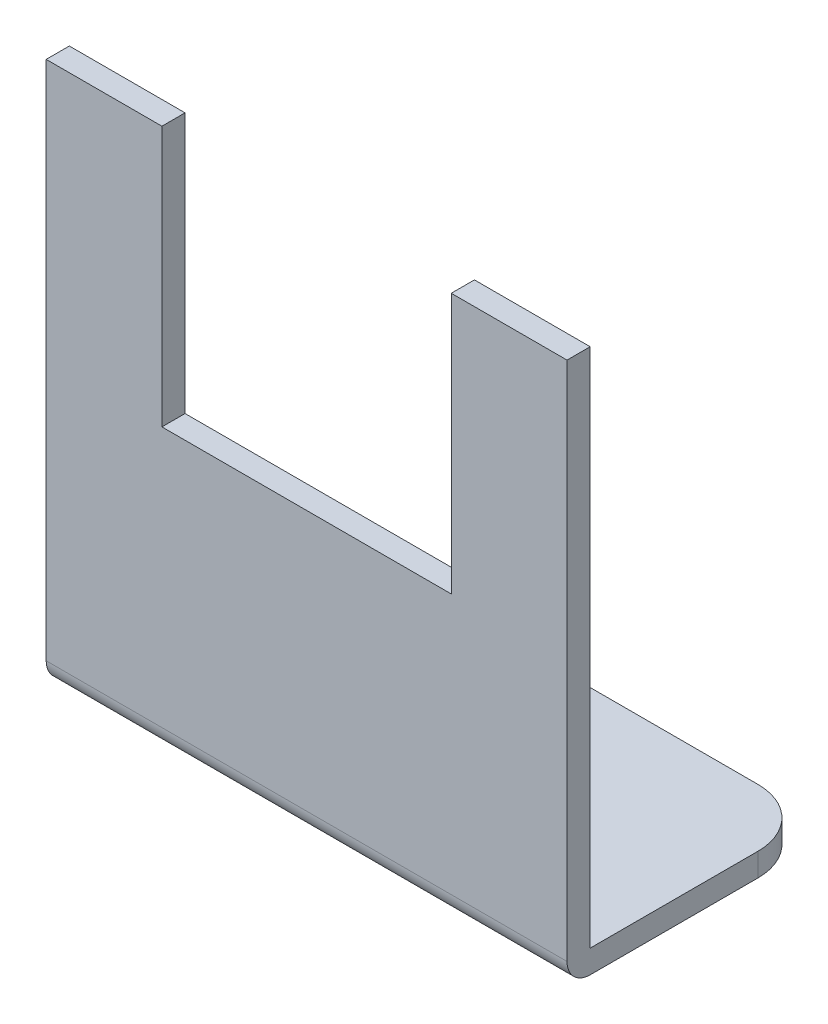
ISO-10303-21;
HEADER;
FILE_DESCRIPTION(('STEP AP214'),'2;1');
FILE_NAME('part.step','',(''),(''),'','','');
FILE_SCHEMA(('AUTOMOTIVE_DESIGN { 1 0 10303 214 1 1 1 1 }'));
ENDSEC;
DATA;
#1=APPLICATION_CONTEXT('core data for automotive mechanical design processes');
#2=APPLICATION_PROTOCOL_DEFINITION('international standard','automotive_design',2000,#1);
#3=PRODUCT_CONTEXT('',#1,'mechanical');
#4=PRODUCT('Part','Part','',(#3));
#5=PRODUCT_RELATED_PRODUCT_CATEGORY('part','',(#4));
#6=PRODUCT_DEFINITION_FORMATION('','',#4);
#7=PRODUCT_DEFINITION_CONTEXT('part definition',#1,'design');
#8=PRODUCT_DEFINITION('design','',#6,#7);
#9=PRODUCT_DEFINITION_SHAPE('','',#8);
#10=(LENGTH_UNIT() NAMED_UNIT(*) SI_UNIT(.MILLI.,.METRE.));
#11=(NAMED_UNIT(*) PLANE_ANGLE_UNIT() SI_UNIT($,.RADIAN.));
#12=(NAMED_UNIT(*) SI_UNIT($,.STERADIAN.) SOLID_ANGLE_UNIT());
#13=UNCERTAINTY_MEASURE_WITH_UNIT(LENGTH_MEASURE(1.E-05),#10,'distance_accuracy_value','');
#14=(GEOMETRIC_REPRESENTATION_CONTEXT(3) GLOBAL_UNCERTAINTY_ASSIGNED_CONTEXT((#13)) GLOBAL_UNIT_ASSIGNED_CONTEXT((#10,
#11,#12)) REPRESENTATION_CONTEXT('',''));
#15=CARTESIAN_POINT('',(0.,0.,0.));
#16=DIRECTION('',(0.,0.,1.));
#17=DIRECTION('',(1.,0.,0.));
#18=AXIS2_PLACEMENT_3D('',#15,#16,#17);
#19=CARTESIAN_POINT('',(0.,0.,0.));
#20=DIRECTION('',(0.,0.,1.));
#21=DIRECTION('',(1.,0.,0.));
#22=AXIS2_PLACEMENT_3D('',#19,#20,#21);
#23=PLANE('',#22);
#24=DIRECTION('',(0.,-1.,0.));
#25=VECTOR('',#24,1.);
#26=CARTESIAN_POINT('',(12.5,0.,0.));
#27=LINE('',#26,#25);
#28=CARTESIAN_POINT('',(12.5,23.5,0.));
#29=VERTEX_POINT('',#28);
#30=CARTESIAN_POINT('',(12.5,0.999999999999997,0.));
#31=VERTEX_POINT('',#30);
#32=EDGE_CURVE('E245',#29,#31,#27,.T.);
#33=ORIENTED_EDGE('',*,*,#32,.F.);
#34=DIRECTION('',(1.,0.,0.));
#35=VECTOR('',#34,1.);
#36=CARTESIAN_POINT('',(-22.5,23.5,0.));
#37=LINE('',#36,#35);
#38=CARTESIAN_POINT('',(22.5,23.5,0.));
#39=VERTEX_POINT('',#38);
#40=EDGE_CURVE('E147',#29,#39,#37,.T.);
#41=ORIENTED_EDGE('',*,*,#40,.T.);
#42=DIRECTION('',(0.,-1.,0.));
#43=VECTOR('',#42,1.);
#44=CARTESIAN_POINT('',(22.5,23.5,0.));
#45=LINE('',#44,#43);
#46=CARTESIAN_POINT('',(22.5,-21.5,0.));
#47=VERTEX_POINT('',#46);
#48=EDGE_CURVE('E166',#39,#47,#45,.T.);
#49=ORIENTED_EDGE('',*,*,#48,.T.);
#50=DIRECTION('',(1.,0.,0.));
#51=VECTOR('',#50,1.);
#52=CARTESIAN_POINT('',(22.5,-21.5,0.));
#53=LINE('',#52,#51);
#54=CARTESIAN_POINT('',(-22.5,-21.5,0.));
#55=VERTEX_POINT('',#54);
#56=EDGE_CURVE('E215',#55,#47,#53,.T.);
#57=ORIENTED_EDGE('',*,*,#56,.F.);
#58=DIRECTION('',(0.,-1.,0.));
#59=VECTOR('',#58,1.);
#60=CARTESIAN_POINT('',(-22.5,23.5,0.));
#61=LINE('',#60,#59);
#62=CARTESIAN_POINT('',(-22.5,23.5,0.));
#63=VERTEX_POINT('',#62);
#64=EDGE_CURVE('E163',#63,#55,#61,.T.);
#65=ORIENTED_EDGE('',*,*,#64,.F.);
#66=CARTESIAN_POINT('',(-12.5,23.5,0.));
#67=VERTEX_POINT('',#66);
#68=EDGE_CURVE('E170',#63,#67,#37,.T.);
#69=ORIENTED_EDGE('',*,*,#68,.T.);
#70=DIRECTION('',(0.,-1.,0.));
#71=VECTOR('',#70,1.);
#72=CARTESIAN_POINT('',(-12.5,0.,0.));
#73=LINE('',#72,#71);
#74=CARTESIAN_POINT('',(-12.5,1.,0.));
#75=VERTEX_POINT('',#74);
#76=EDGE_CURVE('E148',#67,#75,#73,.T.);
#77=ORIENTED_EDGE('',*,*,#76,.T.);
#78=DIRECTION('',(1.,0.,0.));
#79=VECTOR('',#78,1.);
#80=CARTESIAN_POINT('',(0.,0.999999999999999,0.));
#81=LINE('',#80,#79);
#82=EDGE_CURVE('E246',#75,#31,#81,.T.);
#83=ORIENTED_EDGE('',*,*,#82,.T.);
#84=EDGE_LOOP('',(#33,#41,#49,#57,#65,#69,#77,#83));
#85=FACE_BOUND('',#84,.T.);
#86=ADVANCED_FACE('F32',(#85),#23,.F.);
#87=CARTESIAN_POINT('',(-22.5,23.5,2.));
#88=DIRECTION('',(0.,1.,0.));
#89=DIRECTION('',(0.,0.,1.));
#90=AXIS2_PLACEMENT_3D('',#87,#88,#89);
#91=PLANE('',#90);
#92=ORIENTED_EDGE('',*,*,#40,.F.);
#93=DIRECTION('',(0.,0.,1.));
#94=VECTOR('',#93,1.);
#95=CARTESIAN_POINT('',(12.5,23.5,-19.5));
#96=LINE('',#95,#94);
#97=CARTESIAN_POINT('',(12.5,23.5,2.));
#98=VERTEX_POINT('',#97);
#99=EDGE_CURVE('E130',#29,#98,#96,.T.);
#100=ORIENTED_EDGE('',*,*,#99,.T.);
#101=DIRECTION('',(1.,0.,0.));
#102=VECTOR('',#101,1.);
#103=CARTESIAN_POINT('',(-22.5,23.5,2.));
#104=LINE('',#103,#102);
#105=CARTESIAN_POINT('',(22.5,23.5,2.));
#106=VERTEX_POINT('',#105);
#107=EDGE_CURVE('E145',#98,#106,#104,.T.);
#108=ORIENTED_EDGE('',*,*,#107,.T.);
#109=DIRECTION('',(0.,0.,-1.));
#110=VECTOR('',#109,1.);
#111=CARTESIAN_POINT('',(22.5,23.5,2.));
#112=LINE('',#111,#110);
#113=EDGE_CURVE('E174',#106,#39,#112,.T.);
#114=ORIENTED_EDGE('',*,*,#113,.T.);
#115=EDGE_LOOP('',(#92,#100,#108,#114));
#116=FACE_BOUND('',#115,.T.);
#117=ADVANCED_FACE('F143',(#116),#91,.T.);
#118=CARTESIAN_POINT('',(0.,0.,2.));
#119=DIRECTION('',(0.,0.,1.));
#120=DIRECTION('',(1.,0.,0.));
#121=AXIS2_PLACEMENT_3D('',#118,#119,#120);
#122=PLANE('',#121);
#123=ORIENTED_EDGE('',*,*,#107,.F.);
#124=DIRECTION('',(0.,-1.,0.));
#125=VECTOR('',#124,1.);
#126=CARTESIAN_POINT('',(12.5,23.5,2.));
#127=LINE('',#126,#125);
#128=CARTESIAN_POINT('',(12.5,0.999999999999997,2.));
#129=VERTEX_POINT('',#128);
#130=EDGE_CURVE('E127',#98,#129,#127,.T.);
#131=ORIENTED_EDGE('',*,*,#130,.T.);
#132=DIRECTION('',(1.,0.,0.));
#133=VECTOR('',#132,1.);
#134=CARTESIAN_POINT('',(-12.5,1.,2.));
#135=LINE('',#134,#133);
#136=CARTESIAN_POINT('',(-12.5,1.,2.));
#137=VERTEX_POINT('',#136);
#138=EDGE_CURVE('E138',#137,#129,#135,.T.);
#139=ORIENTED_EDGE('',*,*,#138,.F.);
#140=DIRECTION('',(0.,-1.,0.));
#141=VECTOR('',#140,1.);
#142=CARTESIAN_POINT('',(-12.5,23.5,2.));
#143=LINE('',#142,#141);
#144=CARTESIAN_POINT('',(-12.5,23.5,2.));
#145=VERTEX_POINT('',#144);
#146=EDGE_CURVE('E258',#145,#137,#143,.T.);
#147=ORIENTED_EDGE('',*,*,#146,.F.);
#148=CARTESIAN_POINT('',(-22.5,23.5,2.));
#149=VERTEX_POINT('',#148);
#150=EDGE_CURVE('E155',#149,#145,#104,.T.);
#151=ORIENTED_EDGE('',*,*,#150,.F.);
#152=DIRECTION('',(0.,-1.,0.));
#153=VECTOR('',#152,1.);
#154=CARTESIAN_POINT('',(-22.5,23.5,2.));
#155=LINE('',#154,#153);
#156=CARTESIAN_POINT('',(-22.5,-21.5,2.));
#157=VERTEX_POINT('',#156);
#158=EDGE_CURVE('E159',#149,#157,#155,.T.);
#159=ORIENTED_EDGE('',*,*,#158,.T.);
#160=DIRECTION('',(1.,0.,0.));
#161=VECTOR('',#160,1.);
#162=CARTESIAN_POINT('',(22.5,-21.5,2.));
#163=LINE('',#162,#161);
#164=CARTESIAN_POINT('',(22.5,-21.5,2.));
#165=VERTEX_POINT('',#164);
#166=EDGE_CURVE('E181',#157,#165,#163,.T.);
#167=ORIENTED_EDGE('',*,*,#166,.T.);
#168=DIRECTION('',(0.,-1.,0.));
#169=VECTOR('',#168,1.);
#170=CARTESIAN_POINT('',(22.5,23.5,2.));
#171=LINE('',#170,#169);
#172=EDGE_CURVE('E154',#106,#165,#171,.T.);
#173=ORIENTED_EDGE('',*,*,#172,.F.);
#174=EDGE_LOOP('',(#123,#131,#139,#147,#151,#159,#167,#173));
#175=FACE_BOUND('',#174,.T.);
#176=ADVANCED_FACE('F151',(#175),#122,.T.);
#177=CARTESIAN_POINT('',(-22.5,23.5,2.));
#178=DIRECTION('',(1.,0.,0.));
#179=DIRECTION('',(0.,1.,0.));
#180=AXIS2_PLACEMENT_3D('',#177,#178,#179);
#181=PLANE('',#180);
#182=DIRECTION('',(0.,0.,1.));
#183=VECTOR('',#182,1.);
#184=CARTESIAN_POINT('',(-22.5,-21.5,-19.5));
#185=LINE('',#184,#183);
#186=CARTESIAN_POINT('',(-22.5,-21.5,-14.5));
#187=VERTEX_POINT('',#186);
#188=EDGE_CURVE('E167',#187,#55,#185,.T.);
#189=ORIENTED_EDGE('',*,*,#188,.F.);
#190=DIRECTION('',(0.,1.,0.));
#191=VECTOR('',#190,1.);
#192=CARTESIAN_POINT('',(-22.5,23.5,-14.5));
#193=LINE('',#192,#191);
#194=CARTESIAN_POINT('',(-22.5,-23.5,-14.5));
#195=VERTEX_POINT('',#194);
#196=EDGE_CURVE('E199',#187,#195,#193,.F.);
#197=ORIENTED_EDGE('',*,*,#196,.T.);
#198=DIRECTION('',(0.,0.,-1.));
#199=VECTOR('',#198,1.);
#200=CARTESIAN_POINT('',(-22.5,-23.5,2.));
#201=LINE('',#200,#199);
#202=CARTESIAN_POINT('',(-22.5,-23.5,0.));
#203=VERTEX_POINT('',#202);
#204=EDGE_CURVE('E178',#203,#195,#201,.T.);
#205=ORIENTED_EDGE('',*,*,#204,.F.);
#206=CARTESIAN_POINT('',(-22.5,-21.5,0.));
#207=DIRECTION('',(1.,0.,0.));
#208=DIRECTION('',(0.,1.,0.));
#209=AXIS2_PLACEMENT_3D('',#206,#207,#208);
#210=CIRCLE('',#209,2.);
#211=EDGE_CURVE('E187',#203,#157,#210,.F.);
#212=ORIENTED_EDGE('',*,*,#211,.T.);
#213=ORIENTED_EDGE('',*,*,#158,.F.);
#214=DIRECTION('',(0.,0.,-1.));
#215=VECTOR('',#214,1.);
#216=CARTESIAN_POINT('',(-22.5,23.5,2.));
#217=LINE('',#216,#215);
#218=EDGE_CURVE('E158',#149,#63,#217,.T.);
#219=ORIENTED_EDGE('',*,*,#218,.T.);
#220=ORIENTED_EDGE('',*,*,#64,.T.);
#221=EDGE_LOOP('',(#189,#197,#205,#212,#213,#219,#220));
#222=FACE_BOUND('',#221,.T.);
#223=ADVANCED_FACE('F224',(#222),#181,.F.);
#224=CARTESIAN_POINT('',(-22.5,-23.5,2.));
#225=DIRECTION('',(0.,1.,0.));
#226=DIRECTION('',(0.,0.,1.));
#227=AXIS2_PLACEMENT_3D('',#224,#225,#226);
#228=PLANE('',#227);
#229=CARTESIAN_POINT('',(0.,-23.5,-14.5));
#230=DIRECTION('',(0.,1.,0.));
#231=DIRECTION('',(-1.,0.,0.));
#232=AXIS2_PLACEMENT_3D('',#229,#230,#231);
#233=CIRCLE('',#232,1.5);
#234=CARTESIAN_POINT('',(-1.5,-23.5,-14.5));
#235=VERTEX_POINT('',#234);
#236=EDGE_CURVE('E139',#235,#235,#233,.T.);
#237=ORIENTED_EDGE('',*,*,#236,.T.);
#238=EDGE_LOOP('',(#237));
#239=FACE_BOUND('',#238,.T.);
#240=ORIENTED_EDGE('',*,*,#204,.T.);
#241=CARTESIAN_POINT('',(-17.5,-23.5,-14.5));
#242=DIRECTION('',(0.,1.,0.));
#243=DIRECTION('',(0.,0.,1.));
#244=AXIS2_PLACEMENT_3D('',#241,#242,#243);
#245=CIRCLE('',#244,5.);
#246=CARTESIAN_POINT('',(-17.5,-23.5,-19.5));
#247=VERTEX_POINT('',#246);
#248=EDGE_CURVE('E40',#195,#247,#245,.F.);
#249=ORIENTED_EDGE('',*,*,#248,.T.);
#250=DIRECTION('',(-1.,0.,0.));
#251=VECTOR('',#250,1.);
#252=CARTESIAN_POINT('',(22.5,-23.5,-19.5));
#253=LINE('',#252,#251);
#254=CARTESIAN_POINT('',(17.5,-23.5,-19.5));
#255=VERTEX_POINT('',#254);
#256=EDGE_CURVE('E204',#255,#247,#253,.T.);
#257=ORIENTED_EDGE('',*,*,#256,.F.);
#258=CARTESIAN_POINT('',(17.5,-23.5,-14.5));
#259=DIRECTION('',(0.,1.,0.));
#260=DIRECTION('',(0.,0.,1.));
#261=AXIS2_PLACEMENT_3D('',#258,#259,#260);
#262=CIRCLE('',#261,5.);
#263=CARTESIAN_POINT('',(22.5,-23.5,-14.5));
#264=VERTEX_POINT('',#263);
#265=EDGE_CURVE('E55',#255,#264,#262,.F.);
#266=ORIENTED_EDGE('',*,*,#265,.T.);
#267=DIRECTION('',(0.,0.,-1.));
#268=VECTOR('',#267,1.);
#269=CARTESIAN_POINT('',(22.5,-23.5,2.));
#270=LINE('',#269,#268);
#271=CARTESIAN_POINT('',(22.5,-23.5,0.));
#272=VERTEX_POINT('',#271);
#273=EDGE_CURVE('E176',#272,#264,#270,.T.);
#274=ORIENTED_EDGE('',*,*,#273,.F.);
#275=DIRECTION('',(1.,0.,0.));
#276=VECTOR('',#275,1.);
#277=CARTESIAN_POINT('',(-22.5,-23.5,0.));
#278=LINE('',#277,#276);
#279=EDGE_CURVE('E185',#272,#203,#278,.F.);
#280=ORIENTED_EDGE('',*,*,#279,.T.);
#281=EDGE_LOOP('',(#240,#249,#257,#266,#274,#280));
#282=FACE_BOUND('',#281,.T.);
#283=ADVANCED_FACE('F203',(#239,#282),#228,.F.);
#284=CARTESIAN_POINT('',(22.5,23.5,2.));
#285=DIRECTION('',(1.,0.,0.));
#286=DIRECTION('',(0.,1.,0.));
#287=AXIS2_PLACEMENT_3D('',#284,#285,#286);
#288=PLANE('',#287);
#289=ORIENTED_EDGE('',*,*,#273,.T.);
#290=DIRECTION('',(0.,-1.,0.));
#291=VECTOR('',#290,1.);
#292=CARTESIAN_POINT('',(22.5,-21.5,-14.5));
#293=LINE('',#292,#291);
#294=CARTESIAN_POINT('',(22.5,-21.5,-14.5));
#295=VERTEX_POINT('',#294);
#296=EDGE_CURVE('E11',#264,#295,#293,.F.);
#297=ORIENTED_EDGE('',*,*,#296,.T.);
#298=DIRECTION('',(0.,0.,1.));
#299=VECTOR('',#298,1.);
#300=CARTESIAN_POINT('',(22.5,-21.5,-19.5));
#301=LINE('',#300,#299);
#302=EDGE_CURVE('E226',#295,#47,#301,.T.);
#303=ORIENTED_EDGE('',*,*,#302,.T.);
#304=ORIENTED_EDGE('',*,*,#48,.F.);
#305=ORIENTED_EDGE('',*,*,#113,.F.);
#306=ORIENTED_EDGE('',*,*,#172,.T.);
#307=CARTESIAN_POINT('',(22.5,-21.5,0.));
#308=DIRECTION('',(1.,0.,0.));
#309=DIRECTION('',(0.,1.,0.));
#310=AXIS2_PLACEMENT_3D('',#307,#308,#309);
#311=CIRCLE('',#310,2.);
#312=EDGE_CURVE('E183',#165,#272,#311,.T.);
#313=ORIENTED_EDGE('',*,*,#312,.T.);
#314=EDGE_LOOP('',(#289,#297,#303,#304,#305,#306,#313));
#315=FACE_BOUND('',#314,.T.);
#316=ADVANCED_FACE('F239',(#315),#288,.T.);
#317=DIRECTION('',(0.,0.,1.));
#318=VECTOR('',#317,1.);
#319=CARTESIAN_POINT('',(-12.5,23.5,-19.5));
#320=LINE('',#319,#318);
#321=EDGE_CURVE('E47',#67,#145,#320,.T.);
#322=ORIENTED_EDGE('',*,*,#321,.F.);
#323=ORIENTED_EDGE('',*,*,#68,.F.);
#324=ORIENTED_EDGE('',*,*,#218,.F.);
#325=ORIENTED_EDGE('',*,*,#150,.T.);
#326=EDGE_LOOP('',(#322,#323,#324,#325));
#327=FACE_BOUND('',#326,.T.);
#328=ADVANCED_FACE('F276',(#327),#91,.T.);
#329=CARTESIAN_POINT('',(22.5,-21.5,-19.5));
#330=DIRECTION('',(0.,-1.,0.));
#331=DIRECTION('',(1.,0.,0.));
#332=AXIS2_PLACEMENT_3D('',#329,#330,#331);
#333=PLANE('',#332);
#334=CARTESIAN_POINT('',(0.,-21.5,-14.5));
#335=DIRECTION('',(0.,1.,0.));
#336=DIRECTION('',(-1.,0.,0.));
#337=AXIS2_PLACEMENT_3D('',#334,#335,#336);
#338=CIRCLE('',#337,1.5);
#339=CARTESIAN_POINT('',(-1.5,-21.5,-14.5));
#340=VERTEX_POINT('',#339);
#341=EDGE_CURVE('E261',#340,#340,#338,.T.);
#342=ORIENTED_EDGE('',*,*,#341,.F.);
#343=EDGE_LOOP('',(#342));
#344=FACE_BOUND('',#343,.T.);
#345=DIRECTION('',(1.,0.,0.));
#346=VECTOR('',#345,1.);
#347=CARTESIAN_POINT('',(22.5,-21.5,-19.5));
#348=LINE('',#347,#346);
#349=CARTESIAN_POINT('',(-17.5,-21.5,-19.5));
#350=VERTEX_POINT('',#349);
#351=CARTESIAN_POINT('',(17.5,-21.5,-19.5));
#352=VERTEX_POINT('',#351);
#353=EDGE_CURVE('E214',#350,#352,#348,.T.);
#354=ORIENTED_EDGE('',*,*,#353,.F.);
#355=CARTESIAN_POINT('',(-17.5,-21.5,-14.5));
#356=DIRECTION('',(0.,-1.,0.));
#357=DIRECTION('',(1.,0.,0.));
#358=AXIS2_PLACEMENT_3D('',#355,#356,#357);
#359=CIRCLE('',#358,5.);
#360=EDGE_CURVE('E197',#350,#187,#359,.F.);
#361=ORIENTED_EDGE('',*,*,#360,.T.);
#362=ORIENTED_EDGE('',*,*,#188,.T.);
#363=ORIENTED_EDGE('',*,*,#56,.T.);
#364=ORIENTED_EDGE('',*,*,#302,.F.);
#365=CARTESIAN_POINT('',(17.5,-21.5,-14.5));
#366=DIRECTION('',(0.,-1.,0.));
#367=DIRECTION('',(1.,0.,0.));
#368=AXIS2_PLACEMENT_3D('',#365,#366,#367);
#369=CIRCLE('',#368,5.);
#370=EDGE_CURVE('E195',#295,#352,#369,.F.);
#371=ORIENTED_EDGE('',*,*,#370,.T.);
#372=EDGE_LOOP('',(#354,#361,#362,#363,#364,#371));
#373=FACE_BOUND('',#372,.T.);
#374=ADVANCED_FACE('F220',(#344,#373),#333,.F.);
#375=CARTESIAN_POINT('',(0.,0.,-19.5));
#376=DIRECTION('',(0.,0.,1.));
#377=DIRECTION('',(1.,0.,0.));
#378=AXIS2_PLACEMENT_3D('',#375,#376,#377);
#379=PLANE('',#378);
#380=ORIENTED_EDGE('',*,*,#256,.T.);
#381=DIRECTION('',(0.,1.,0.));
#382=VECTOR('',#381,1.);
#383=CARTESIAN_POINT('',(-17.5,0.,-19.5));
#384=LINE('',#383,#382);
#385=EDGE_CURVE('E192',#247,#350,#384,.T.);
#386=ORIENTED_EDGE('',*,*,#385,.T.);
#387=ORIENTED_EDGE('',*,*,#353,.T.);
#388=DIRECTION('',(0.,-1.,0.));
#389=VECTOR('',#388,1.);
#390=CARTESIAN_POINT('',(17.5,-23.5,-19.5));
#391=LINE('',#390,#389);
#392=EDGE_CURVE('E189',#352,#255,#391,.T.);
#393=ORIENTED_EDGE('',*,*,#392,.T.);
#394=EDGE_LOOP('',(#380,#386,#387,#393));
#395=FACE_BOUND('',#394,.T.);
#396=ADVANCED_FACE('F210',(#395),#379,.F.);
#397=CARTESIAN_POINT('',(0.,-21.5,0.));
#398=DIRECTION('',(-1.,0.,0.));
#399=DIRECTION('',(0.,0.,1.));
#400=AXIS2_PLACEMENT_3D('',#397,#398,#399);
#401=CYLINDRICAL_SURFACE('',#400,2.);
#402=ORIENTED_EDGE('',*,*,#211,.F.);
#403=ORIENTED_EDGE('',*,*,#279,.F.);
#404=ORIENTED_EDGE('',*,*,#312,.F.);
#405=ORIENTED_EDGE('',*,*,#166,.F.);
#406=EDGE_LOOP('',(#402,#403,#404,#405));
#407=FACE_BOUND('',#406,.T.);
#408=ADVANCED_FACE('F236',(#407),#401,.T.);
#409=CARTESIAN_POINT('',(-17.5,0.,-14.5));
#410=DIRECTION('',(0.,1.,0.));
#411=DIRECTION('',(-1.,0.,0.));
#412=AXIS2_PLACEMENT_3D('',#409,#410,#411);
#413=CYLINDRICAL_SURFACE('',#412,5.);
#414=ORIENTED_EDGE('',*,*,#248,.F.);
#415=ORIENTED_EDGE('',*,*,#196,.F.);
#416=ORIENTED_EDGE('',*,*,#360,.F.);
#417=ORIENTED_EDGE('',*,*,#385,.F.);
#418=EDGE_LOOP('',(#414,#415,#416,#417));
#419=FACE_BOUND('',#418,.T.);
#420=ADVANCED_FACE('F217',(#419),#413,.T.);
#421=CARTESIAN_POINT('',(17.5,0.,-14.5));
#422=DIRECTION('',(0.,1.,0.));
#423=DIRECTION('',(-1.,0.,0.));
#424=AXIS2_PLACEMENT_3D('',#421,#422,#423);
#425=CYLINDRICAL_SURFACE('',#424,5.);
#426=ORIENTED_EDGE('',*,*,#370,.F.);
#427=ORIENTED_EDGE('',*,*,#296,.F.);
#428=ORIENTED_EDGE('',*,*,#265,.F.);
#429=ORIENTED_EDGE('',*,*,#392,.F.);
#430=EDGE_LOOP('',(#426,#427,#428,#429));
#431=FACE_BOUND('',#430,.T.);
#432=ADVANCED_FACE('F34',(#431),#425,.T.);
#433=CARTESIAN_POINT('',(12.5,23.5,-19.5));
#434=DIRECTION('',(-1.,0.,0.));
#435=DIRECTION('',(0.,-1.,0.));
#436=AXIS2_PLACEMENT_3D('',#433,#434,#435);
#437=PLANE('',#436);
#438=ORIENTED_EDGE('',*,*,#32,.T.);
#439=DIRECTION('',(0.,0.,1.));
#440=VECTOR('',#439,1.);
#441=CARTESIAN_POINT('',(12.5,0.999999999999997,-19.5));
#442=LINE('',#441,#440);
#443=EDGE_CURVE('E133',#31,#129,#442,.T.);
#444=ORIENTED_EDGE('',*,*,#443,.T.);
#445=ORIENTED_EDGE('',*,*,#130,.F.);
#446=ORIENTED_EDGE('',*,*,#99,.F.);
#447=EDGE_LOOP('',(#438,#444,#445,#446));
#448=FACE_BOUND('',#447,.T.);
#449=ADVANCED_FACE('F129',(#448),#437,.T.);
#450=CARTESIAN_POINT('',(-12.5,1.,-19.5));
#451=DIRECTION('',(0.,-1.,0.));
#452=DIRECTION('',(1.,0.,0.));
#453=AXIS2_PLACEMENT_3D('',#450,#451,#452);
#454=PLANE('',#453);
#455=DIRECTION('',(0.,0.,1.));
#456=VECTOR('',#455,1.);
#457=CARTESIAN_POINT('',(-12.5,1.,-19.5));
#458=LINE('',#457,#456);
#459=EDGE_CURVE('E255',#75,#137,#458,.T.);
#460=ORIENTED_EDGE('',*,*,#459,.T.);
#461=ORIENTED_EDGE('',*,*,#138,.T.);
#462=ORIENTED_EDGE('',*,*,#443,.F.);
#463=ORIENTED_EDGE('',*,*,#82,.F.);
#464=EDGE_LOOP('',(#460,#461,#462,#463));
#465=FACE_BOUND('',#464,.T.);
#466=ADVANCED_FACE('F307',(#465),#454,.F.);
#467=CARTESIAN_POINT('',(-12.5,23.5,-19.5));
#468=DIRECTION('',(-1.,0.,0.));
#469=DIRECTION('',(0.,-1.,0.));
#470=AXIS2_PLACEMENT_3D('',#467,#468,#469);
#471=PLANE('',#470);
#472=ORIENTED_EDGE('',*,*,#321,.T.);
#473=ORIENTED_EDGE('',*,*,#146,.T.);
#474=ORIENTED_EDGE('',*,*,#459,.F.);
#475=ORIENTED_EDGE('',*,*,#76,.F.);
#476=EDGE_LOOP('',(#472,#473,#474,#475));
#477=FACE_BOUND('',#476,.T.);
#478=ADVANCED_FACE('F271',(#477),#471,.F.);
#479=CARTESIAN_POINT('',(0.,-23.5,-14.5));
#480=DIRECTION('',(0.,1.,0.));
#481=DIRECTION('',(-1.,0.,0.));
#482=AXIS2_PLACEMENT_3D('',#479,#480,#481);
#483=CYLINDRICAL_SURFACE('',#482,1.5);
#484=ORIENTED_EDGE('',*,*,#236,.F.);
#485=EDGE_LOOP('',(#484));
#486=FACE_BOUND('',#485,.T.);
#487=ORIENTED_EDGE('',*,*,#341,.T.);
#488=EDGE_LOOP('',(#487));
#489=FACE_BOUND('',#488,.T.);
#490=ADVANCED_FACE('F268',(#486,#489),#483,.F.);
#491=CLOSED_SHELL('',(#86,#117,#176,#223,#283,#316,#328,#374,#396,#408,#420,#432,#449,#466,#478,#490));
#492=MANIFOLD_SOLID_BREP('B2',#491);
#493=ADVANCED_BREP_SHAPE_REPRESENTATION('',(#18,#492),#14);
#494=SHAPE_DEFINITION_REPRESENTATION(#9,#493);
ENDSEC;
END-ISO-10303-21;
